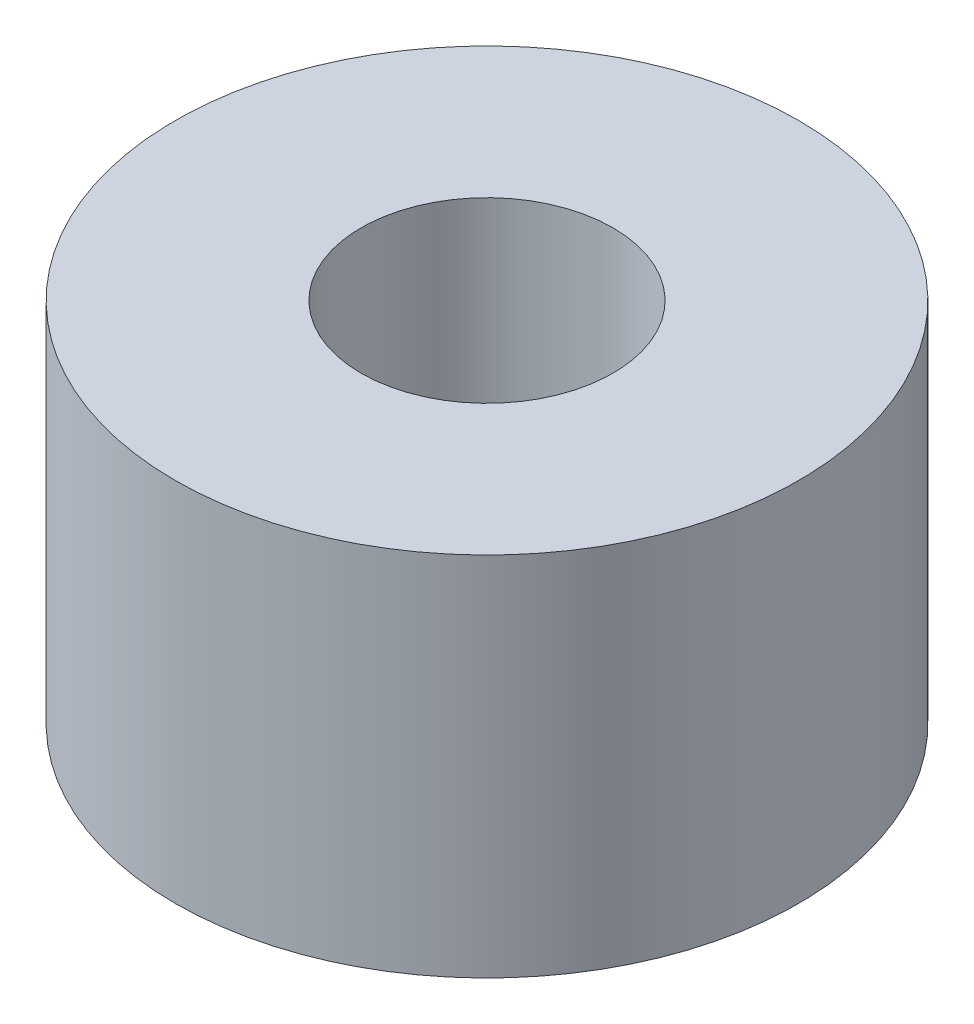
ISO-10303-21;
HEADER;
FILE_DESCRIPTION(('STEP AP214'),'2;1');
FILE_NAME('part.step','',(''),(''),'','','');
FILE_SCHEMA(('AUTOMOTIVE_DESIGN { 1 0 10303 214 1 1 1 1 }'));
ENDSEC;
DATA;
#1=APPLICATION_CONTEXT('core data for automotive mechanical design processes');
#2=APPLICATION_PROTOCOL_DEFINITION('international standard','automotive_design',2000,#1);
#3=PRODUCT_CONTEXT('',#1,'mechanical');
#4=PRODUCT('Part','Part','',(#3));
#5=PRODUCT_RELATED_PRODUCT_CATEGORY('part','',(#4));
#6=PRODUCT_DEFINITION_FORMATION('','',#4);
#7=PRODUCT_DEFINITION_CONTEXT('part definition',#1,'design');
#8=PRODUCT_DEFINITION('design','',#6,#7);
#9=PRODUCT_DEFINITION_SHAPE('','',#8);
#10=(LENGTH_UNIT() NAMED_UNIT(*) SI_UNIT(.MILLI.,.METRE.));
#11=(NAMED_UNIT(*) PLANE_ANGLE_UNIT() SI_UNIT($,.RADIAN.));
#12=(NAMED_UNIT(*) SI_UNIT($,.STERADIAN.) SOLID_ANGLE_UNIT());
#13=UNCERTAINTY_MEASURE_WITH_UNIT(LENGTH_MEASURE(1.E-05),#10,'distance_accuracy_value','');
#14=(GEOMETRIC_REPRESENTATION_CONTEXT(3) GLOBAL_UNCERTAINTY_ASSIGNED_CONTEXT((#13)) GLOBAL_UNIT_ASSIGNED_CONTEXT((#10,
#11,#12)) REPRESENTATION_CONTEXT('',''));
#15=CARTESIAN_POINT('',(0.,0.,0.));
#16=DIRECTION('',(0.,0.,1.));
#17=DIRECTION('',(1.,0.,0.));
#18=AXIS2_PLACEMENT_3D('',#15,#16,#17);
#19=CARTESIAN_POINT('',(0.,5.8166,0.));
#20=DIRECTION('',(0.,1.,0.));
#21=DIRECTION('',(0.,0.,1.));
#22=AXIS2_PLACEMENT_3D('',#19,#20,#21);
#23=PLANE('',#22);
#24=CARTESIAN_POINT('',(0.,5.8166,0.));
#25=DIRECTION('',(0.,1.,0.));
#26=DIRECTION('',(0.,0.,1.));
#27=AXIS2_PLACEMENT_3D('',#24,#25,#26);
#28=CIRCLE('',#27,4.95);
#29=CARTESIAN_POINT('',(0.,5.8166,4.95));
#30=VERTEX_POINT('',#29);
#31=EDGE_CURVE('E10',#30,#30,#28,.T.);
#32=ORIENTED_EDGE('',*,*,#31,.T.);
#33=EDGE_LOOP('',(#32));
#34=FACE_BOUND('',#33,.T.);
#35=CARTESIAN_POINT('',(0.,5.8166,0.));
#36=DIRECTION('',(0.,1.,0.));
#37=DIRECTION('',(0.,0.,1.));
#38=AXIS2_PLACEMENT_3D('',#35,#36,#37);
#39=CIRCLE('',#38,2.);
#40=CARTESIAN_POINT('',(0.,5.8166,2.));
#41=VERTEX_POINT('',#40);
#42=EDGE_CURVE('E48',#41,#41,#39,.T.);
#43=ORIENTED_EDGE('',*,*,#42,.F.);
#44=EDGE_LOOP('',(#43));
#45=FACE_BOUND('',#44,.T.);
#46=ADVANCED_FACE('F37',(#34,#45),#23,.T.);
#47=CARTESIAN_POINT('',(0.,0.,0.));
#48=DIRECTION('',(0.,1.,0.));
#49=DIRECTION('',(0.,0.,1.));
#50=AXIS2_PLACEMENT_3D('',#47,#48,#49);
#51=PLANE('',#50);
#52=CARTESIAN_POINT('',(0.,0.,0.));
#53=DIRECTION('',(0.,1.,0.));
#54=DIRECTION('',(0.,0.,1.));
#55=AXIS2_PLACEMENT_3D('',#52,#53,#54);
#56=CIRCLE('',#55,4.95);
#57=CARTESIAN_POINT('',(0.,0.,4.95));
#58=VERTEX_POINT('',#57);
#59=EDGE_CURVE('E41',#58,#58,#56,.T.);
#60=ORIENTED_EDGE('',*,*,#59,.F.);
#61=EDGE_LOOP('',(#60));
#62=FACE_BOUND('',#61,.T.);
#63=CARTESIAN_POINT('',(0.,0.,0.));
#64=DIRECTION('',(0.,1.,0.));
#65=DIRECTION('',(0.,0.,1.));
#66=AXIS2_PLACEMENT_3D('',#63,#64,#65);
#67=CIRCLE('',#66,2.);
#68=CARTESIAN_POINT('',(0.,0.,2.));
#69=VERTEX_POINT('',#68);
#70=EDGE_CURVE('E50',#69,#69,#67,.T.);
#71=ORIENTED_EDGE('',*,*,#70,.T.);
#72=EDGE_LOOP('',(#71));
#73=FACE_BOUND('',#72,.T.);
#74=ADVANCED_FACE('F60',(#62,#73),#51,.F.);
#75=CARTESIAN_POINT('',(0.,5.8166,0.));
#76=DIRECTION('',(0.,-1.,0.));
#77=DIRECTION('',(0.,0.,-1.));
#78=AXIS2_PLACEMENT_3D('',#75,#76,#77);
#79=CYLINDRICAL_SURFACE('',#78,4.95);
#80=ORIENTED_EDGE('',*,*,#31,.F.);
#81=EDGE_LOOP('',(#80));
#82=FACE_BOUND('',#81,.T.);
#83=ORIENTED_EDGE('',*,*,#59,.T.);
#84=EDGE_LOOP('',(#83));
#85=FACE_BOUND('',#84,.T.);
#86=ADVANCED_FACE('F39',(#82,#85),#79,.T.);
#87=CARTESIAN_POINT('',(0.,5.8166,0.));
#88=DIRECTION('',(0.,-1.,0.));
#89=DIRECTION('',(0.,0.,-1.));
#90=AXIS2_PLACEMENT_3D('',#87,#88,#89);
#91=CYLINDRICAL_SURFACE('',#90,2.);
#92=ORIENTED_EDGE('',*,*,#42,.T.);
#93=EDGE_LOOP('',(#92));
#94=FACE_BOUND('',#93,.T.);
#95=ORIENTED_EDGE('',*,*,#70,.F.);
#96=EDGE_LOOP('',(#95));
#97=FACE_BOUND('',#96,.T.);
#98=ADVANCED_FACE('F56',(#94,#97),#91,.F.);
#99=CLOSED_SHELL('',(#46,#74,#86,#98));
#100=MANIFOLD_SOLID_BREP('B2',#99);
#101=ADVANCED_BREP_SHAPE_REPRESENTATION('',(#18,#100),#14);
#102=SHAPE_DEFINITION_REPRESENTATION(#9,#101);
ENDSEC;
END-ISO-10303-21;
